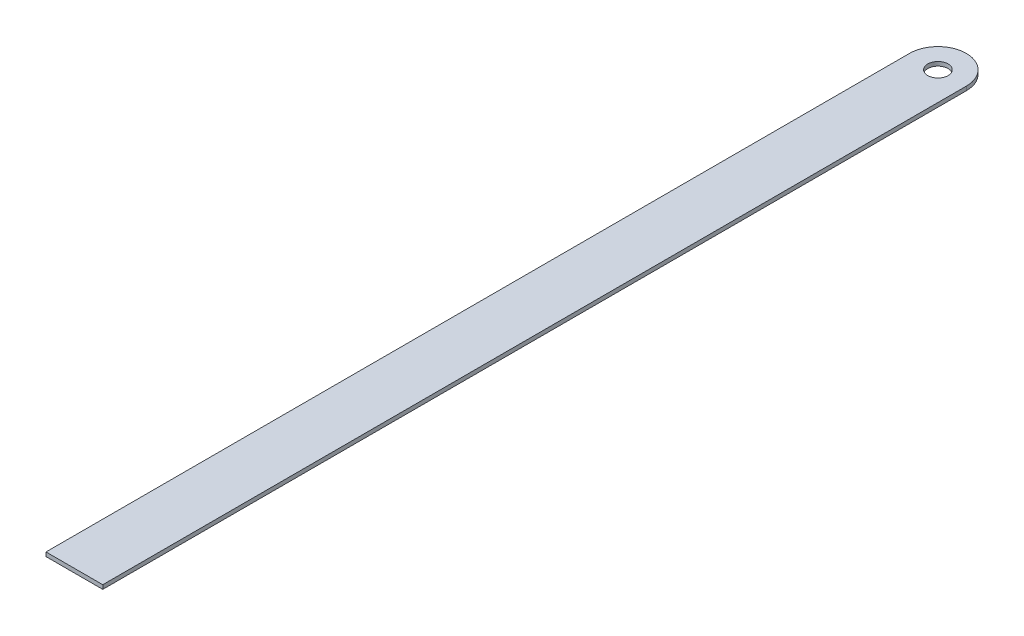
ISO-10303-21;
HEADER;
FILE_DESCRIPTION(('STEP AP214'),'2;1');
FILE_NAME('part.step','',(''),(''),'','','');
FILE_SCHEMA(('AUTOMOTIVE_DESIGN { 1 0 10303 214 1 1 1 1 }'));
ENDSEC;
DATA;
#1=APPLICATION_CONTEXT('core data for automotive mechanical design processes');
#2=APPLICATION_PROTOCOL_DEFINITION('international standard','automotive_design',2000,#1);
#3=PRODUCT_CONTEXT('',#1,'mechanical');
#4=PRODUCT('Part','Part','',(#3));
#5=PRODUCT_RELATED_PRODUCT_CATEGORY('part','',(#4));
#6=PRODUCT_DEFINITION_FORMATION('','',#4);
#7=PRODUCT_DEFINITION_CONTEXT('part definition',#1,'design');
#8=PRODUCT_DEFINITION('design','',#6,#7);
#9=PRODUCT_DEFINITION_SHAPE('','',#8);
#10=(LENGTH_UNIT() NAMED_UNIT(*) SI_UNIT(.MILLI.,.METRE.));
#11=(NAMED_UNIT(*) PLANE_ANGLE_UNIT() SI_UNIT($,.RADIAN.));
#12=(NAMED_UNIT(*) SI_UNIT($,.STERADIAN.) SOLID_ANGLE_UNIT());
#13=UNCERTAINTY_MEASURE_WITH_UNIT(LENGTH_MEASURE(1.E-05),#10,'distance_accuracy_value','');
#14=(GEOMETRIC_REPRESENTATION_CONTEXT(3) GLOBAL_UNCERTAINTY_ASSIGNED_CONTEXT((#13)) GLOBAL_UNIT_ASSIGNED_CONTEXT((#10,
#11,#12)) REPRESENTATION_CONTEXT('',''));
#15=CARTESIAN_POINT('',(0.,0.,0.));
#16=DIRECTION('',(0.,0.,1.));
#17=DIRECTION('',(1.,0.,0.));
#18=AXIS2_PLACEMENT_3D('',#15,#16,#17);
#19=CARTESIAN_POINT('',(0.,1.,0.));
#20=DIRECTION('',(1.,0.,0.));
#21=DIRECTION('',(0.,0.,-1.));
#22=AXIS2_PLACEMENT_3D('',#19,#20,#21);
#23=PLANE('',#22);
#24=DIRECTION('',(0.,0.,1.));
#25=VECTOR('',#24,1.);
#26=CARTESIAN_POINT('',(0.,0.,0.));
#27=LINE('',#26,#25);
#28=CARTESIAN_POINT('',(0.,0.,-213.));
#29=VERTEX_POINT('',#28);
#30=CARTESIAN_POINT('',(0.,0.,0.));
#31=VERTEX_POINT('',#30);
#32=EDGE_CURVE('E89',#29,#31,#27,.T.);
#33=ORIENTED_EDGE('',*,*,#32,.T.);
#34=DIRECTION('',(0.,-1.,0.));
#35=VECTOR('',#34,1.);
#36=CARTESIAN_POINT('',(0.,1.,0.));
#37=LINE('',#36,#35);
#38=CARTESIAN_POINT('',(0.,1.,0.));
#39=VERTEX_POINT('',#38);
#40=EDGE_CURVE('E11',#39,#31,#37,.T.);
#41=ORIENTED_EDGE('',*,*,#40,.F.);
#42=DIRECTION('',(0.,0.,1.));
#43=VECTOR('',#42,1.);
#44=CARTESIAN_POINT('',(0.,1.,0.));
#45=LINE('',#44,#43);
#46=CARTESIAN_POINT('',(0.,1.,-213.));
#47=VERTEX_POINT('',#46);
#48=EDGE_CURVE('E79',#47,#39,#45,.T.);
#49=ORIENTED_EDGE('',*,*,#48,.F.);
#50=DIRECTION('',(0.,-1.,0.));
#51=VECTOR('',#50,1.);
#52=CARTESIAN_POINT('',(0.,25.4131112314674,-213.));
#53=LINE('',#52,#51);
#54=EDGE_CURVE('E98',#47,#29,#53,.T.);
#55=ORIENTED_EDGE('',*,*,#54,.T.);
#56=EDGE_LOOP('',(#33,#41,#49,#55));
#57=FACE_BOUND('',#56,.T.);
#58=ADVANCED_FACE('F45',(#57),#23,.F.);
#59=CARTESIAN_POINT('',(0.,1.,0.));
#60=DIRECTION('',(0.,0.,-1.));
#61=DIRECTION('',(-1.,0.,0.));
#62=AXIS2_PLACEMENT_3D('',#59,#60,#61);
#63=PLANE('',#62);
#64=DIRECTION('',(1.,0.,0.));
#65=VECTOR('',#64,1.);
#66=CARTESIAN_POINT('',(0.,0.,0.));
#67=LINE('',#66,#65);
#68=CARTESIAN_POINT('',(14.,0.,0.));
#69=VERTEX_POINT('',#68);
#70=EDGE_CURVE('E73',#31,#69,#67,.T.);
#71=ORIENTED_EDGE('',*,*,#70,.T.);
#72=DIRECTION('',(0.,-1.,0.));
#73=VECTOR('',#72,1.);
#74=CARTESIAN_POINT('',(14.,1.,0.));
#75=LINE('',#74,#73);
#76=CARTESIAN_POINT('',(14.,1.,0.));
#77=VERTEX_POINT('',#76);
#78=EDGE_CURVE('E54',#77,#69,#75,.T.);
#79=ORIENTED_EDGE('',*,*,#78,.F.);
#80=DIRECTION('',(1.,0.,0.));
#81=VECTOR('',#80,1.);
#82=CARTESIAN_POINT('',(0.,1.,0.));
#83=LINE('',#82,#81);
#84=EDGE_CURVE('E62',#39,#77,#83,.T.);
#85=ORIENTED_EDGE('',*,*,#84,.F.);
#86=ORIENTED_EDGE('',*,*,#40,.T.);
#87=EDGE_LOOP('',(#71,#79,#85,#86));
#88=FACE_BOUND('',#87,.T.);
#89=ADVANCED_FACE('F138',(#88),#63,.F.);
#90=CARTESIAN_POINT('',(14.,1.,0.));
#91=DIRECTION('',(-1.,0.,0.));
#92=DIRECTION('',(0.,0.,1.));
#93=AXIS2_PLACEMENT_3D('',#90,#91,#92);
#94=PLANE('',#93);
#95=DIRECTION('',(0.,0.,-1.));
#96=VECTOR('',#95,1.);
#97=CARTESIAN_POINT('',(14.,0.,0.));
#98=LINE('',#97,#96);
#99=CARTESIAN_POINT('',(14.,0.,-213.));
#100=VERTEX_POINT('',#99);
#101=EDGE_CURVE('E123',#69,#100,#98,.T.);
#102=ORIENTED_EDGE('',*,*,#101,.T.);
#103=DIRECTION('',(0.,-1.,0.));
#104=VECTOR('',#103,1.);
#105=CARTESIAN_POINT('',(14.,25.4131112314674,-213.));
#106=LINE('',#105,#104);
#107=CARTESIAN_POINT('',(14.,1.,-213.));
#108=VERTEX_POINT('',#107);
#109=EDGE_CURVE('E102',#108,#100,#106,.T.);
#110=ORIENTED_EDGE('',*,*,#109,.F.);
#111=DIRECTION('',(0.,0.,-1.));
#112=VECTOR('',#111,1.);
#113=CARTESIAN_POINT('',(14.,1.,0.));
#114=LINE('',#113,#112);
#115=EDGE_CURVE('E126',#77,#108,#114,.T.);
#116=ORIENTED_EDGE('',*,*,#115,.F.);
#117=ORIENTED_EDGE('',*,*,#78,.T.);
#118=EDGE_LOOP('',(#102,#110,#116,#117));
#119=FACE_BOUND('',#118,.T.);
#120=ADVANCED_FACE('F136',(#119),#94,.F.);
#121=CARTESIAN_POINT('',(0.,1.,0.));
#122=DIRECTION('',(0.,-1.,0.));
#123=DIRECTION('',(0.,0.,-1.));
#124=AXIS2_PLACEMENT_3D('',#121,#122,#123);
#125=PLANE('',#124);
#126=ORIENTED_EDGE('',*,*,#48,.T.);
#127=ORIENTED_EDGE('',*,*,#84,.T.);
#128=ORIENTED_EDGE('',*,*,#115,.T.);
#129=CARTESIAN_POINT('',(7.,1.,-213.));
#130=DIRECTION('',(0.,-1.,0.));
#131=DIRECTION('',(0.,0.,-1.));
#132=AXIS2_PLACEMENT_3D('',#129,#130,#131);
#133=CIRCLE('',#132,7.);
#134=EDGE_CURVE('E116',#108,#47,#133,.F.);
#135=ORIENTED_EDGE('',*,*,#134,.T.);
#136=EDGE_LOOP('',(#126,#127,#128,#135));
#137=FACE_BOUND('',#136,.T.);
#138=CARTESIAN_POINT('',(7.,1.,-213.));
#139=DIRECTION('',(0.,-1.,0.));
#140=DIRECTION('',(0.,0.,-1.));
#141=AXIS2_PLACEMENT_3D('',#138,#139,#140);
#142=CIRCLE('',#141,2.5);
#143=CARTESIAN_POINT('',(7.,1.,-215.5));
#144=VERTEX_POINT('',#143);
#145=EDGE_CURVE('E95',#144,#144,#142,.F.);
#146=ORIENTED_EDGE('',*,*,#145,.F.);
#147=EDGE_LOOP('',(#146));
#148=FACE_BOUND('',#147,.T.);
#149=ADVANCED_FACE('F139',(#137,#148),#125,.F.);
#150=CARTESIAN_POINT('',(0.,0.,0.));
#151=DIRECTION('',(0.,-1.,0.));
#152=DIRECTION('',(0.,0.,-1.));
#153=AXIS2_PLACEMENT_3D('',#150,#151,#152);
#154=PLANE('',#153);
#155=ORIENTED_EDGE('',*,*,#32,.F.);
#156=CARTESIAN_POINT('',(7.,0.,-213.));
#157=DIRECTION('',(0.,-1.,0.));
#158=DIRECTION('',(0.,0.,-1.));
#159=AXIS2_PLACEMENT_3D('',#156,#157,#158);
#160=CIRCLE('',#159,7.);
#161=EDGE_CURVE('E93',#29,#100,#160,.T.);
#162=ORIENTED_EDGE('',*,*,#161,.T.);
#163=ORIENTED_EDGE('',*,*,#101,.F.);
#164=ORIENTED_EDGE('',*,*,#70,.F.);
#165=EDGE_LOOP('',(#155,#162,#163,#164));
#166=FACE_BOUND('',#165,.T.);
#167=CARTESIAN_POINT('',(7.,0.,-213.));
#168=DIRECTION('',(0.,-1.,0.));
#169=DIRECTION('',(0.,0.,-1.));
#170=AXIS2_PLACEMENT_3D('',#167,#168,#169);
#171=CIRCLE('',#170,2.5);
#172=CARTESIAN_POINT('',(7.,0.,-215.5));
#173=VERTEX_POINT('',#172);
#174=EDGE_CURVE('E108',#173,#173,#171,.T.);
#175=ORIENTED_EDGE('',*,*,#174,.F.);
#176=EDGE_LOOP('',(#175));
#177=FACE_BOUND('',#176,.T.);
#178=ADVANCED_FACE('F90',(#166,#177),#154,.T.);
#179=CARTESIAN_POINT('',(7.,25.4131112314674,-213.));
#180=DIRECTION('',(0.,-1.,0.));
#181=DIRECTION('',(0.,0.,-1.));
#182=AXIS2_PLACEMENT_3D('',#179,#180,#181);
#183=CYLINDRICAL_SURFACE('',#182,7.);
#184=ORIENTED_EDGE('',*,*,#134,.F.);
#185=ORIENTED_EDGE('',*,*,#109,.T.);
#186=ORIENTED_EDGE('',*,*,#161,.F.);
#187=ORIENTED_EDGE('',*,*,#54,.F.);
#188=EDGE_LOOP('',(#184,#185,#186,#187));
#189=FACE_BOUND('',#188,.T.);
#190=ADVANCED_FACE('F105',(#189),#183,.T.);
#191=CARTESIAN_POINT('',(7.,25.4131112314674,-213.));
#192=DIRECTION('',(0.,-1.,0.));
#193=DIRECTION('',(0.,0.,-1.));
#194=AXIS2_PLACEMENT_3D('',#191,#192,#193);
#195=CYLINDRICAL_SURFACE('',#194,2.5);
#196=ORIENTED_EDGE('',*,*,#145,.T.);
#197=EDGE_LOOP('',(#196));
#198=FACE_BOUND('',#197,.T.);
#199=ORIENTED_EDGE('',*,*,#174,.T.);
#200=EDGE_LOOP('',(#199));
#201=FACE_BOUND('',#200,.T.);
#202=ADVANCED_FACE('F146',(#198,#201),#195,.F.);
#203=CLOSED_SHELL('',(#58,#89,#120,#149,#178,#190,#202));
#204=MANIFOLD_SOLID_BREP('B2',#203);
#205=ADVANCED_BREP_SHAPE_REPRESENTATION('',(#18,#204),#14);
#206=SHAPE_DEFINITION_REPRESENTATION(#9,#205);
ENDSEC;
END-ISO-10303-21;
